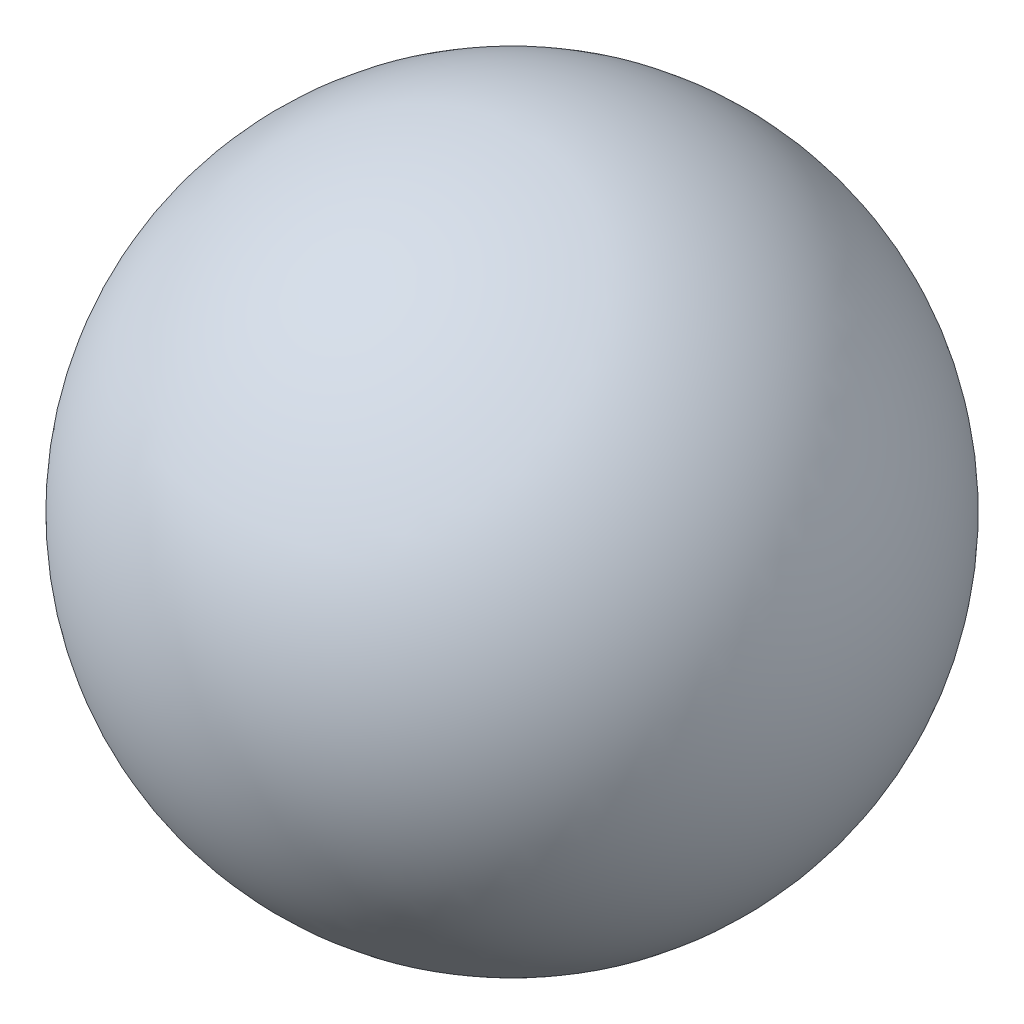
ISO-10303-21;
HEADER;
FILE_DESCRIPTION(('STEP AP214'),'2;1');
FILE_NAME('part.step','',(''),(''),'','','');
FILE_SCHEMA(('AUTOMOTIVE_DESIGN { 1 0 10303 214 1 1 1 1 }'));
ENDSEC;
DATA;
#1=APPLICATION_CONTEXT('core data for automotive mechanical design processes');
#2=APPLICATION_PROTOCOL_DEFINITION('international standard','automotive_design',2000,#1);
#3=PRODUCT_CONTEXT('',#1,'mechanical');
#4=PRODUCT('Part','Part','',(#3));
#5=PRODUCT_RELATED_PRODUCT_CATEGORY('part','',(#4));
#6=PRODUCT_DEFINITION_FORMATION('','',#4);
#7=PRODUCT_DEFINITION_CONTEXT('part definition',#1,'design');
#8=PRODUCT_DEFINITION('design','',#6,#7);
#9=PRODUCT_DEFINITION_SHAPE('','',#8);
#10=(LENGTH_UNIT() NAMED_UNIT(*) SI_UNIT(.MILLI.,.METRE.));
#11=(NAMED_UNIT(*) PLANE_ANGLE_UNIT() SI_UNIT($,.RADIAN.));
#12=(NAMED_UNIT(*) SI_UNIT($,.STERADIAN.) SOLID_ANGLE_UNIT());
#13=UNCERTAINTY_MEASURE_WITH_UNIT(LENGTH_MEASURE(1.E-05),#10,'distance_accuracy_value','');
#14=(GEOMETRIC_REPRESENTATION_CONTEXT(3) GLOBAL_UNCERTAINTY_ASSIGNED_CONTEXT((#13)) GLOBAL_UNIT_ASSIGNED_CONTEXT((#10,
#11,#12)) REPRESENTATION_CONTEXT('',''));
#15=CARTESIAN_POINT('',(0.,0.,0.));
#16=DIRECTION('',(0.,0.,1.));
#17=DIRECTION('',(1.,0.,0.));
#18=AXIS2_PLACEMENT_3D('',#15,#16,#17);
#19=CARTESIAN_POINT('',(0.,0.,0.));
#20=DIRECTION('',(0.,-1.,0.));
#21=DIRECTION('',(0.,0.,1.));
#22=AXIS2_PLACEMENT_3D('',#19,#20,#21);
#23=SPHERICAL_SURFACE('',#22,3.312);
#24=CARTESIAN_POINT('',(0.,-3.312,0.));
#25=VERTEX_POINT('',#24);
#26=VERTEX_LOOP('',#25);
#27=FACE_BOUND('',#26,.T.);
#28=ADVANCED_FACE('F34',(#27),#23,.T.);
#29=CLOSED_SHELL('',(#28));
#30=MANIFOLD_SOLID_BREP('B2',#29);
#31=ADVANCED_BREP_SHAPE_REPRESENTATION('',(#18,#30),#14);
#32=SHAPE_DEFINITION_REPRESENTATION(#9,#31);
ENDSEC;
END-ISO-10303-21;
